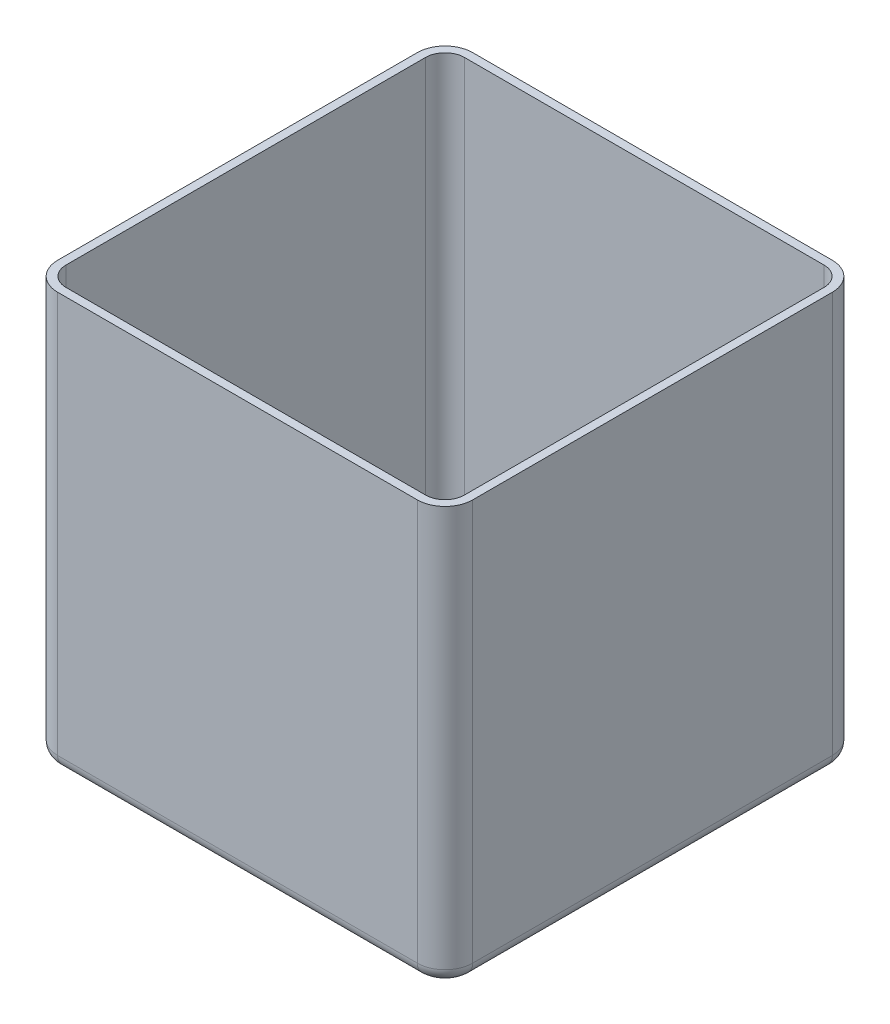
ISO-10303-21;
HEADER;
FILE_DESCRIPTION(('STEP AP214'),'2;1');
FILE_NAME('part.step','',(''),(''),'','','');
FILE_SCHEMA(('AUTOMOTIVE_DESIGN { 1 0 10303 214 1 1 1 1 }'));
ENDSEC;
DATA;
#1=APPLICATION_CONTEXT('core data for automotive mechanical design processes');
#2=APPLICATION_PROTOCOL_DEFINITION('international standard','automotive_design',2000,#1);
#3=PRODUCT_CONTEXT('',#1,'mechanical');
#4=PRODUCT('Part','Part','',(#3));
#5=PRODUCT_RELATED_PRODUCT_CATEGORY('part','',(#4));
#6=PRODUCT_DEFINITION_FORMATION('','',#4);
#7=PRODUCT_DEFINITION_CONTEXT('part definition',#1,'design');
#8=PRODUCT_DEFINITION('design','',#6,#7);
#9=PRODUCT_DEFINITION_SHAPE('','',#8);
#10=(LENGTH_UNIT() NAMED_UNIT(*) SI_UNIT(.MILLI.,.METRE.));
#11=(NAMED_UNIT(*) PLANE_ANGLE_UNIT() SI_UNIT($,.RADIAN.));
#12=(NAMED_UNIT(*) SI_UNIT($,.STERADIAN.) SOLID_ANGLE_UNIT());
#13=UNCERTAINTY_MEASURE_WITH_UNIT(LENGTH_MEASURE(1.E-05),#10,'distance_accuracy_value','');
#14=(GEOMETRIC_REPRESENTATION_CONTEXT(3) GLOBAL_UNCERTAINTY_ASSIGNED_CONTEXT((#13)) GLOBAL_UNIT_ASSIGNED_CONTEXT((#10,
#11,#12)) REPRESENTATION_CONTEXT('',''));
#15=CARTESIAN_POINT('',(0.,0.,0.));
#16=DIRECTION('',(0.,0.,1.));
#17=DIRECTION('',(1.,0.,0.));
#18=AXIS2_PLACEMENT_3D('',#15,#16,#17);
#19=CARTESIAN_POINT('',(-75.,-150.,75.));
#20=DIRECTION('',(-1.,0.,0.));
#21=DIRECTION('',(0.,0.,1.));
#22=AXIS2_PLACEMENT_3D('',#19,#20,#21);
#23=PLANE('',#22);
#24=DIRECTION('',(0.,1.,0.));
#25=VECTOR('',#24,1.);
#26=CARTESIAN_POINT('',(-75.,-150.,-65.));
#27=LINE('',#26,#25);
#28=CARTESIAN_POINT('',(-75.,0.,-65.));
#29=VERTEX_POINT('',#28);
#30=CARTESIAN_POINT('',(-75.,-145.,-65.));
#31=VERTEX_POINT('',#30);
#32=EDGE_CURVE('E325',#29,#31,#27,.F.);
#33=ORIENTED_EDGE('',*,*,#32,.T.);
#34=DIRECTION('',(0.,0.,1.));
#35=VECTOR('',#34,1.);
#36=CARTESIAN_POINT('',(-75.,-145.,65.));
#37=LINE('',#36,#35);
#38=CARTESIAN_POINT('',(-75.,-145.,65.));
#39=VERTEX_POINT('',#38);
#40=EDGE_CURVE('E380',#31,#39,#37,.T.);
#41=ORIENTED_EDGE('',*,*,#40,.T.);
#42=DIRECTION('',(0.,1.,0.));
#43=VECTOR('',#42,1.);
#44=CARTESIAN_POINT('',(-75.,-150.,65.));
#45=LINE('',#44,#43);
#46=CARTESIAN_POINT('',(-75.,0.,65.));
#47=VERTEX_POINT('',#46);
#48=EDGE_CURVE('E328',#39,#47,#45,.T.);
#49=ORIENTED_EDGE('',*,*,#48,.T.);
#50=DIRECTION('',(0.,0.,1.));
#51=VECTOR('',#50,1.);
#52=CARTESIAN_POINT('',(-75.,0.,75.));
#53=LINE('',#52,#51);
#54=EDGE_CURVE('E313',#29,#47,#53,.T.);
#55=ORIENTED_EDGE('',*,*,#54,.F.);
#56=EDGE_LOOP('',(#33,#41,#49,#55));
#57=FACE_BOUND('',#56,.T.);
#58=ADVANCED_FACE('F37',(#57),#23,.T.);
#59=CARTESIAN_POINT('',(75.,-150.,-75.));
#60=DIRECTION('',(0.,0.,-1.));
#61=DIRECTION('',(-1.,0.,0.));
#62=AXIS2_PLACEMENT_3D('',#59,#60,#61);
#63=PLANE('',#62);
#64=DIRECTION('',(0.,1.,0.));
#65=VECTOR('',#64,1.);
#66=CARTESIAN_POINT('',(65.,-150.,-75.));
#67=LINE('',#66,#65);
#68=CARTESIAN_POINT('',(65.,0.,-75.));
#69=VERTEX_POINT('',#68);
#70=CARTESIAN_POINT('',(65.,-145.,-75.));
#71=VERTEX_POINT('',#70);
#72=EDGE_CURVE('E342',#69,#71,#67,.F.);
#73=ORIENTED_EDGE('',*,*,#72,.T.);
#74=DIRECTION('',(-1.,0.,0.));
#75=VECTOR('',#74,1.);
#76=CARTESIAN_POINT('',(-65.,-145.,-75.));
#77=LINE('',#76,#75);
#78=CARTESIAN_POINT('',(-65.,-145.,-75.));
#79=VERTEX_POINT('',#78);
#80=EDGE_CURVE('E376',#71,#79,#77,.T.);
#81=ORIENTED_EDGE('',*,*,#80,.T.);
#82=DIRECTION('',(0.,1.,0.));
#83=VECTOR('',#82,1.);
#84=CARTESIAN_POINT('',(-65.,-150.,-75.));
#85=LINE('',#84,#83);
#86=CARTESIAN_POINT('',(-65.,0.,-75.));
#87=VERTEX_POINT('',#86);
#88=EDGE_CURVE('E345',#79,#87,#85,.T.);
#89=ORIENTED_EDGE('',*,*,#88,.T.);
#90=DIRECTION('',(-1.,0.,0.));
#91=VECTOR('',#90,1.);
#92=CARTESIAN_POINT('',(75.,0.,-75.));
#93=LINE('',#92,#91);
#94=EDGE_CURVE('E322',#69,#87,#93,.T.);
#95=ORIENTED_EDGE('',*,*,#94,.F.);
#96=EDGE_LOOP('',(#73,#81,#89,#95));
#97=FACE_BOUND('',#96,.T.);
#98=ADVANCED_FACE('F428',(#97),#63,.T.);
#99=CARTESIAN_POINT('',(75.,-150.,75.));
#100=DIRECTION('',(1.,0.,0.));
#101=DIRECTION('',(0.,0.,-1.));
#102=AXIS2_PLACEMENT_3D('',#99,#100,#101);
#103=PLANE('',#102);
#104=DIRECTION('',(0.,1.,0.));
#105=VECTOR('',#104,1.);
#106=CARTESIAN_POINT('',(75.,-150.,65.));
#107=LINE('',#106,#105);
#108=CARTESIAN_POINT('',(75.,0.,65.));
#109=VERTEX_POINT('',#108);
#110=CARTESIAN_POINT('',(75.,-145.,65.));
#111=VERTEX_POINT('',#110);
#112=EDGE_CURVE('E349',#109,#111,#107,.F.);
#113=ORIENTED_EDGE('',*,*,#112,.T.);
#114=DIRECTION('',(0.,0.,-1.));
#115=VECTOR('',#114,1.);
#116=CARTESIAN_POINT('',(75.,-145.,-65.));
#117=LINE('',#116,#115);
#118=CARTESIAN_POINT('',(75.,-145.,-65.));
#119=VERTEX_POINT('',#118);
#120=EDGE_CURVE('E372',#111,#119,#117,.T.);
#121=ORIENTED_EDGE('',*,*,#120,.T.);
#122=DIRECTION('',(0.,1.,0.));
#123=VECTOR('',#122,1.);
#124=CARTESIAN_POINT('',(75.,-150.,-65.));
#125=LINE('',#124,#123);
#126=CARTESIAN_POINT('',(75.,0.,-65.));
#127=VERTEX_POINT('',#126);
#128=EDGE_CURVE('E347',#119,#127,#125,.T.);
#129=ORIENTED_EDGE('',*,*,#128,.T.);
#130=DIRECTION('',(0.,0.,-1.));
#131=VECTOR('',#130,1.);
#132=CARTESIAN_POINT('',(75.,0.,75.));
#133=LINE('',#132,#131);
#134=EDGE_CURVE('E319',#109,#127,#133,.T.);
#135=ORIENTED_EDGE('',*,*,#134,.F.);
#136=EDGE_LOOP('',(#113,#121,#129,#135));
#137=FACE_BOUND('',#136,.T.);
#138=ADVANCED_FACE('F481',(#137),#103,.T.);
#139=CARTESIAN_POINT('',(75.,-150.,75.));
#140=DIRECTION('',(0.,0.,1.));
#141=DIRECTION('',(1.,0.,0.));
#142=AXIS2_PLACEMENT_3D('',#139,#140,#141);
#143=PLANE('',#142);
#144=DIRECTION('',(0.,1.,0.));
#145=VECTOR('',#144,1.);
#146=CARTESIAN_POINT('',(-65.,-150.,75.));
#147=LINE('',#146,#145);
#148=CARTESIAN_POINT('',(-65.,0.,75.));
#149=VERTEX_POINT('',#148);
#150=CARTESIAN_POINT('',(-65.,-145.,75.));
#151=VERTEX_POINT('',#150);
#152=EDGE_CURVE('E340',#149,#151,#147,.F.);
#153=ORIENTED_EDGE('',*,*,#152,.T.);
#154=DIRECTION('',(1.,0.,0.));
#155=VECTOR('',#154,1.);
#156=CARTESIAN_POINT('',(65.,-145.,75.));
#157=LINE('',#156,#155);
#158=CARTESIAN_POINT('',(65.,-145.,75.));
#159=VERTEX_POINT('',#158);
#160=EDGE_CURVE('E11',#151,#159,#157,.T.);
#161=ORIENTED_EDGE('',*,*,#160,.T.);
#162=DIRECTION('',(0.,1.,0.));
#163=VECTOR('',#162,1.);
#164=CARTESIAN_POINT('',(65.,-150.,75.));
#165=LINE('',#164,#163);
#166=CARTESIAN_POINT('',(65.,0.,75.));
#167=VERTEX_POINT('',#166);
#168=EDGE_CURVE('E338',#159,#167,#165,.T.);
#169=ORIENTED_EDGE('',*,*,#168,.T.);
#170=DIRECTION('',(1.,0.,0.));
#171=VECTOR('',#170,1.);
#172=CARTESIAN_POINT('',(75.,0.,75.));
#173=LINE('',#172,#171);
#174=EDGE_CURVE('E316',#149,#167,#173,.T.);
#175=ORIENTED_EDGE('',*,*,#174,.F.);
#176=EDGE_LOOP('',(#153,#161,#169,#175));
#177=FACE_BOUND('',#176,.T.);
#178=ADVANCED_FACE('F458',(#177),#143,.T.);
#179=CARTESIAN_POINT('',(-75.,-150.,-75.));
#180=DIRECTION('',(0.,1.,0.));
#181=DIRECTION('',(0.,0.,1.));
#182=AXIS2_PLACEMENT_3D('',#179,#180,#181);
#183=PLANE('',#182);
#184=DIRECTION('',(0.,0.,-1.));
#185=VECTOR('',#184,1.);
#186=CARTESIAN_POINT('',(70.,-150.,65.));
#187=LINE('',#186,#185);
#188=CARTESIAN_POINT('',(70.,-150.,-65.));
#189=VERTEX_POINT('',#188);
#190=CARTESIAN_POINT('',(70.,-150.,65.));
#191=VERTEX_POINT('',#190);
#192=EDGE_CURVE('E364',#189,#191,#187,.F.);
#193=ORIENTED_EDGE('',*,*,#192,.T.);
#194=CARTESIAN_POINT('',(65.,-150.,65.));
#195=DIRECTION('',(0.,1.,0.));
#196=DIRECTION('',(0.,0.,1.));
#197=AXIS2_PLACEMENT_3D('',#194,#195,#196);
#198=CIRCLE('',#197,5.);
#199=CARTESIAN_POINT('',(65.,-150.,70.));
#200=VERTEX_POINT('',#199);
#201=EDGE_CURVE('E366',#191,#200,#198,.F.);
#202=ORIENTED_EDGE('',*,*,#201,.T.);
#203=DIRECTION('',(1.,0.,0.));
#204=VECTOR('',#203,1.);
#205=CARTESIAN_POINT('',(-65.,-150.,70.));
#206=LINE('',#205,#204);
#207=CARTESIAN_POINT('',(-65.,-150.,70.));
#208=VERTEX_POINT('',#207);
#209=EDGE_CURVE('E352',#200,#208,#206,.F.);
#210=ORIENTED_EDGE('',*,*,#209,.T.);
#211=CARTESIAN_POINT('',(-65.,-150.,65.));
#212=DIRECTION('',(0.,1.,0.));
#213=DIRECTION('',(0.,0.,1.));
#214=AXIS2_PLACEMENT_3D('',#211,#212,#213);
#215=CIRCLE('',#214,5.);
#216=CARTESIAN_POINT('',(-70.,-150.,65.));
#217=VERTEX_POINT('',#216);
#218=EDGE_CURVE('E354',#208,#217,#215,.F.);
#219=ORIENTED_EDGE('',*,*,#218,.T.);
#220=DIRECTION('',(0.,0.,1.));
#221=VECTOR('',#220,1.);
#222=CARTESIAN_POINT('',(-70.,-150.,-65.));
#223=LINE('',#222,#221);
#224=CARTESIAN_POINT('',(-70.,-150.,-65.));
#225=VERTEX_POINT('',#224);
#226=EDGE_CURVE('E356',#217,#225,#223,.F.);
#227=ORIENTED_EDGE('',*,*,#226,.T.);
#228=CARTESIAN_POINT('',(-65.,-150.,-65.));
#229=DIRECTION('',(0.,1.,0.));
#230=DIRECTION('',(0.,0.,1.));
#231=AXIS2_PLACEMENT_3D('',#228,#229,#230);
#232=CIRCLE('',#231,5.);
#233=CARTESIAN_POINT('',(-65.,-150.,-70.));
#234=VERTEX_POINT('',#233);
#235=EDGE_CURVE('E358',#225,#234,#232,.F.);
#236=ORIENTED_EDGE('',*,*,#235,.T.);
#237=DIRECTION('',(-1.,0.,0.));
#238=VECTOR('',#237,1.);
#239=CARTESIAN_POINT('',(65.,-150.,-70.));
#240=LINE('',#239,#238);
#241=CARTESIAN_POINT('',(65.,-150.,-70.));
#242=VERTEX_POINT('',#241);
#243=EDGE_CURVE('E360',#234,#242,#240,.F.);
#244=ORIENTED_EDGE('',*,*,#243,.T.);
#245=CARTESIAN_POINT('',(65.,-150.,-65.));
#246=DIRECTION('',(0.,1.,0.));
#247=DIRECTION('',(0.,0.,1.));
#248=AXIS2_PLACEMENT_3D('',#245,#246,#247);
#249=CIRCLE('',#248,5.);
#250=EDGE_CURVE('E362',#242,#189,#249,.F.);
#251=ORIENTED_EDGE('',*,*,#250,.T.);
#252=EDGE_LOOP('',(#193,#202,#210,#219,#227,#236,#244,#251));
#253=FACE_BOUND('',#252,.T.);
#254=ADVANCED_FACE('F444',(#253),#183,.F.);
#255=CARTESIAN_POINT('',(-75.,0.,-75.));
#256=DIRECTION('',(0.,1.,0.));
#257=DIRECTION('',(0.,0.,1.));
#258=AXIS2_PLACEMENT_3D('',#255,#256,#257);
#259=PLANE('',#258);
#260=DIRECTION('',(0.,0.,1.));
#261=VECTOR('',#260,1.);
#262=CARTESIAN_POINT('',(-72.,0.,-75.));
#263=LINE('',#262,#261);
#264=CARTESIAN_POINT('',(-72.,0.,-65.));
#265=VERTEX_POINT('',#264);
#266=CARTESIAN_POINT('',(-72.,0.,65.));
#267=VERTEX_POINT('',#266);
#268=EDGE_CURVE('E219',#265,#267,#263,.T.);
#269=ORIENTED_EDGE('',*,*,#268,.F.);
#270=CARTESIAN_POINT('',(-65.,0.,-65.));
#271=DIRECTION('',(0.,1.,0.));
#272=DIRECTION('',(0.,0.,1.));
#273=AXIS2_PLACEMENT_3D('',#270,#271,#272);
#274=CIRCLE('',#273,7.);
#275=CARTESIAN_POINT('',(-65.,0.,-72.));
#276=VERTEX_POINT('',#275);
#277=EDGE_CURVE('E302',#276,#265,#274,.T.);
#278=ORIENTED_EDGE('',*,*,#277,.F.);
#279=DIRECTION('',(-1.,0.,0.));
#280=VECTOR('',#279,1.);
#281=CARTESIAN_POINT('',(-75.,0.,-72.));
#282=LINE('',#281,#280);
#283=CARTESIAN_POINT('',(65.,0.,-72.));
#284=VERTEX_POINT('',#283);
#285=EDGE_CURVE('E54',#284,#276,#282,.T.);
#286=ORIENTED_EDGE('',*,*,#285,.F.);
#287=CARTESIAN_POINT('',(65.,0.,-65.));
#288=DIRECTION('',(0.,1.,0.));
#289=DIRECTION('',(0.,0.,1.));
#290=AXIS2_PLACEMENT_3D('',#287,#288,#289);
#291=CIRCLE('',#290,7.);
#292=CARTESIAN_POINT('',(72.,0.,-65.));
#293=VERTEX_POINT('',#292);
#294=EDGE_CURVE('E223',#293,#284,#291,.T.);
#295=ORIENTED_EDGE('',*,*,#294,.F.);
#296=DIRECTION('',(0.,0.,-1.));
#297=VECTOR('',#296,1.);
#298=CARTESIAN_POINT('',(72.,0.,-75.));
#299=LINE('',#298,#297);
#300=CARTESIAN_POINT('',(72.,0.,65.));
#301=VERTEX_POINT('',#300);
#302=EDGE_CURVE('E305',#301,#293,#299,.T.);
#303=ORIENTED_EDGE('',*,*,#302,.F.);
#304=CARTESIAN_POINT('',(65.,0.,65.));
#305=DIRECTION('',(0.,1.,0.));
#306=DIRECTION('',(0.,0.,1.));
#307=AXIS2_PLACEMENT_3D('',#304,#305,#306);
#308=CIRCLE('',#307,7.);
#309=CARTESIAN_POINT('',(65.,0.,72.));
#310=VERTEX_POINT('',#309);
#311=EDGE_CURVE('E306',#310,#301,#308,.T.);
#312=ORIENTED_EDGE('',*,*,#311,.F.);
#313=DIRECTION('',(1.,0.,0.));
#314=VECTOR('',#313,1.);
#315=CARTESIAN_POINT('',(-75.,0.,72.));
#316=LINE('',#315,#314);
#317=CARTESIAN_POINT('',(-65.,0.,72.));
#318=VERTEX_POINT('',#317);
#319=EDGE_CURVE('E300',#318,#310,#316,.T.);
#320=ORIENTED_EDGE('',*,*,#319,.F.);
#321=CARTESIAN_POINT('',(-65.,0.,65.));
#322=DIRECTION('',(0.,1.,0.));
#323=DIRECTION('',(0.,0.,1.));
#324=AXIS2_PLACEMENT_3D('',#321,#322,#323);
#325=CIRCLE('',#324,7.);
#326=EDGE_CURVE('E249',#267,#318,#325,.T.);
#327=ORIENTED_EDGE('',*,*,#326,.F.);
#328=EDGE_LOOP('',(#269,#278,#286,#295,#303,#312,#320,#327));
#329=FACE_BOUND('',#328,.T.);
#330=ORIENTED_EDGE('',*,*,#54,.T.);
#331=CARTESIAN_POINT('',(-65.,0.,65.));
#332=DIRECTION('',(0.,1.,0.));
#333=DIRECTION('',(0.,0.,1.));
#334=AXIS2_PLACEMENT_3D('',#331,#332,#333);
#335=CIRCLE('',#334,10.);
#336=EDGE_CURVE('E336',#47,#149,#335,.T.);
#337=ORIENTED_EDGE('',*,*,#336,.T.);
#338=ORIENTED_EDGE('',*,*,#174,.T.);
#339=CARTESIAN_POINT('',(65.,0.,65.));
#340=DIRECTION('',(0.,1.,0.));
#341=DIRECTION('',(0.,0.,1.));
#342=AXIS2_PLACEMENT_3D('',#339,#340,#341);
#343=CIRCLE('',#342,10.);
#344=EDGE_CURVE('E332',#167,#109,#343,.T.);
#345=ORIENTED_EDGE('',*,*,#344,.T.);
#346=ORIENTED_EDGE('',*,*,#134,.T.);
#347=CARTESIAN_POINT('',(65.,0.,-65.));
#348=DIRECTION('',(0.,1.,0.));
#349=DIRECTION('',(0.,0.,1.));
#350=AXIS2_PLACEMENT_3D('',#347,#348,#349);
#351=CIRCLE('',#350,10.);
#352=EDGE_CURVE('E330',#127,#69,#351,.T.);
#353=ORIENTED_EDGE('',*,*,#352,.T.);
#354=ORIENTED_EDGE('',*,*,#94,.T.);
#355=CARTESIAN_POINT('',(-65.,0.,-65.));
#356=DIRECTION('',(0.,1.,0.));
#357=DIRECTION('',(0.,0.,1.));
#358=AXIS2_PLACEMENT_3D('',#355,#356,#357);
#359=CIRCLE('',#358,10.);
#360=EDGE_CURVE('E334',#87,#29,#359,.T.);
#361=ORIENTED_EDGE('',*,*,#360,.T.);
#362=EDGE_LOOP('',(#330,#337,#338,#345,#346,#353,#354,#361));
#363=FACE_BOUND('',#362,.T.);
#364=ADVANCED_FACE('F422',(#329,#363),#259,.T.);
#365=CARTESIAN_POINT('',(-65.,-150.,65.));
#366=DIRECTION('',(0.,1.,0.));
#367=DIRECTION('',(0.,0.,1.));
#368=AXIS2_PLACEMENT_3D('',#365,#366,#367);
#369=CYLINDRICAL_SURFACE('',#368,10.);
#370=ORIENTED_EDGE('',*,*,#48,.F.);
#371=CARTESIAN_POINT('',(-65.,-145.,65.));
#372=DIRECTION('',(0.,1.,0.));
#373=DIRECTION('',(0.,0.,1.));
#374=AXIS2_PLACEMENT_3D('',#371,#372,#373);
#375=CIRCLE('',#374,10.);
#376=EDGE_CURVE('E46',#39,#151,#375,.T.);
#377=ORIENTED_EDGE('',*,*,#376,.T.);
#378=ORIENTED_EDGE('',*,*,#152,.F.);
#379=ORIENTED_EDGE('',*,*,#336,.F.);
#380=EDGE_LOOP('',(#370,#377,#378,#379));
#381=FACE_BOUND('',#380,.T.);
#382=ADVANCED_FACE('F486',(#381),#369,.T.);
#383=CARTESIAN_POINT('',(-65.,-150.,-65.));
#384=DIRECTION('',(0.,1.,0.));
#385=DIRECTION('',(0.,0.,1.));
#386=AXIS2_PLACEMENT_3D('',#383,#384,#385);
#387=CYLINDRICAL_SURFACE('',#386,10.);
#388=ORIENTED_EDGE('',*,*,#88,.F.);
#389=CARTESIAN_POINT('',(-65.,-145.,-65.));
#390=DIRECTION('',(0.,1.,0.));
#391=DIRECTION('',(0.,0.,1.));
#392=AXIS2_PLACEMENT_3D('',#389,#390,#391);
#393=CIRCLE('',#392,10.);
#394=EDGE_CURVE('E378',#79,#31,#393,.T.);
#395=ORIENTED_EDGE('',*,*,#394,.T.);
#396=ORIENTED_EDGE('',*,*,#32,.F.);
#397=ORIENTED_EDGE('',*,*,#360,.F.);
#398=EDGE_LOOP('',(#388,#395,#396,#397));
#399=FACE_BOUND('',#398,.T.);
#400=ADVANCED_FACE('F416',(#399),#387,.T.);
#401=CARTESIAN_POINT('',(65.,-150.,65.));
#402=DIRECTION('',(0.,1.,0.));
#403=DIRECTION('',(0.,0.,1.));
#404=AXIS2_PLACEMENT_3D('',#401,#402,#403);
#405=CYLINDRICAL_SURFACE('',#404,10.);
#406=ORIENTED_EDGE('',*,*,#168,.F.);
#407=CARTESIAN_POINT('',(65.,-145.,65.));
#408=DIRECTION('',(0.,1.,0.));
#409=DIRECTION('',(0.,0.,1.));
#410=AXIS2_PLACEMENT_3D('',#407,#408,#409);
#411=CIRCLE('',#410,10.);
#412=EDGE_CURVE('E369',#159,#111,#411,.T.);
#413=ORIENTED_EDGE('',*,*,#412,.T.);
#414=ORIENTED_EDGE('',*,*,#112,.F.);
#415=ORIENTED_EDGE('',*,*,#344,.F.);
#416=EDGE_LOOP('',(#406,#413,#414,#415));
#417=FACE_BOUND('',#416,.T.);
#418=ADVANCED_FACE('F462',(#417),#405,.T.);
#419=CARTESIAN_POINT('',(65.,-150.,-65.));
#420=DIRECTION('',(0.,1.,0.));
#421=DIRECTION('',(0.,0.,1.));
#422=AXIS2_PLACEMENT_3D('',#419,#420,#421);
#423=CYLINDRICAL_SURFACE('',#422,10.);
#424=ORIENTED_EDGE('',*,*,#128,.F.);
#425=CARTESIAN_POINT('',(65.,-145.,-65.));
#426=DIRECTION('',(0.,1.,0.));
#427=DIRECTION('',(0.,0.,1.));
#428=AXIS2_PLACEMENT_3D('',#425,#426,#427);
#429=CIRCLE('',#428,10.);
#430=EDGE_CURVE('E374',#119,#71,#429,.T.);
#431=ORIENTED_EDGE('',*,*,#430,.T.);
#432=ORIENTED_EDGE('',*,*,#72,.F.);
#433=ORIENTED_EDGE('',*,*,#352,.F.);
#434=EDGE_LOOP('',(#424,#431,#432,#433));
#435=FACE_BOUND('',#434,.T.);
#436=ADVANCED_FACE('F431',(#435),#423,.T.);
#437=CARTESIAN_POINT('',(-65.,-145.,-65.));
#438=DIRECTION('',(0.,1.,0.));
#439=DIRECTION('',(0.,0.,1.));
#440=AXIS2_PLACEMENT_3D('',#437,#438,#439);
#441=DEGENERATE_TOROIDAL_SURFACE('',#440,5.,5.,.T.);
#442=CARTESIAN_POINT('',(-70.,-145.,-65.));
#443=DIRECTION('',(0.,0.,1.));
#444=DIRECTION('',(1.,0.,0.));
#445=AXIS2_PLACEMENT_3D('',#442,#443,#444);
#446=CIRCLE('',#445,5.);
#447=EDGE_CURVE('E397',#31,#225,#446,.T.);
#448=ORIENTED_EDGE('',*,*,#447,.F.);
#449=ORIENTED_EDGE('',*,*,#394,.F.);
#450=CARTESIAN_POINT('',(-65.,-145.,-70.));
#451=DIRECTION('',(1.,0.,0.));
#452=DIRECTION('',(0.,0.,-1.));
#453=AXIS2_PLACEMENT_3D('',#450,#451,#452);
#454=CIRCLE('',#453,5.);
#455=EDGE_CURVE('E41',#234,#79,#454,.T.);
#456=ORIENTED_EDGE('',*,*,#455,.F.);
#457=ORIENTED_EDGE('',*,*,#235,.F.);
#458=EDGE_LOOP('',(#448,#449,#456,#457));
#459=FACE_BOUND('',#458,.T.);
#460=ADVANCED_FACE('F39',(#459),#441,.T.);
#461=CARTESIAN_POINT('',(75.,-145.,-70.));
#462=DIRECTION('',(1.,0.,0.));
#463=DIRECTION('',(0.,0.,-1.));
#464=AXIS2_PLACEMENT_3D('',#461,#462,#463);
#465=CYLINDRICAL_SURFACE('',#464,5.);
#466=ORIENTED_EDGE('',*,*,#455,.T.);
#467=ORIENTED_EDGE('',*,*,#80,.F.);
#468=CARTESIAN_POINT('',(65.,-145.,-70.));
#469=DIRECTION('',(1.,0.,0.));
#470=DIRECTION('',(0.,0.,-1.));
#471=AXIS2_PLACEMENT_3D('',#468,#469,#470);
#472=CIRCLE('',#471,5.);
#473=EDGE_CURVE('E395',#242,#71,#472,.T.);
#474=ORIENTED_EDGE('',*,*,#473,.F.);
#475=ORIENTED_EDGE('',*,*,#243,.F.);
#476=EDGE_LOOP('',(#466,#467,#474,#475));
#477=FACE_BOUND('',#476,.T.);
#478=ADVANCED_FACE('F408',(#477),#465,.T.);
#479=CARTESIAN_POINT('',(-70.,-145.,75.));
#480=DIRECTION('',(0.,0.,-1.));
#481=DIRECTION('',(-1.,0.,0.));
#482=AXIS2_PLACEMENT_3D('',#479,#480,#481);
#483=CYLINDRICAL_SURFACE('',#482,5.);
#484=ORIENTED_EDGE('',*,*,#447,.T.);
#485=ORIENTED_EDGE('',*,*,#226,.F.);
#486=CARTESIAN_POINT('',(-70.,-145.,65.));
#487=DIRECTION('',(0.,0.,1.));
#488=DIRECTION('',(1.,0.,0.));
#489=AXIS2_PLACEMENT_3D('',#486,#487,#488);
#490=CIRCLE('',#489,5.);
#491=EDGE_CURVE('E392',#39,#217,#490,.T.);
#492=ORIENTED_EDGE('',*,*,#491,.F.);
#493=ORIENTED_EDGE('',*,*,#40,.F.);
#494=EDGE_LOOP('',(#484,#485,#492,#493));
#495=FACE_BOUND('',#494,.T.);
#496=ADVANCED_FACE('F447',(#495),#483,.T.);
#497=CARTESIAN_POINT('',(65.,-145.,-65.));
#498=DIRECTION('',(0.,1.,0.));
#499=DIRECTION('',(0.,0.,1.));
#500=AXIS2_PLACEMENT_3D('',#497,#498,#499);
#501=DEGENERATE_TOROIDAL_SURFACE('',#500,5.,5.,.T.);
#502=ORIENTED_EDGE('',*,*,#473,.T.);
#503=ORIENTED_EDGE('',*,*,#430,.F.);
#504=CARTESIAN_POINT('',(70.,-145.,-65.));
#505=DIRECTION('',(0.,0.,1.));
#506=DIRECTION('',(1.,0.,0.));
#507=AXIS2_PLACEMENT_3D('',#504,#505,#506);
#508=CIRCLE('',#507,5.);
#509=EDGE_CURVE('E389',#189,#119,#508,.T.);
#510=ORIENTED_EDGE('',*,*,#509,.F.);
#511=ORIENTED_EDGE('',*,*,#250,.F.);
#512=EDGE_LOOP('',(#502,#503,#510,#511));
#513=FACE_BOUND('',#512,.T.);
#514=ADVANCED_FACE('F435',(#513),#501,.T.);
#515=CARTESIAN_POINT('',(-65.,-145.,65.));
#516=DIRECTION('',(0.,1.,0.));
#517=DIRECTION('',(0.,0.,1.));
#518=AXIS2_PLACEMENT_3D('',#515,#516,#517);
#519=DEGENERATE_TOROIDAL_SURFACE('',#518,5.,5.,.T.);
#520=ORIENTED_EDGE('',*,*,#491,.T.);
#521=ORIENTED_EDGE('',*,*,#218,.F.);
#522=CARTESIAN_POINT('',(-65.,-145.,70.));
#523=DIRECTION('',(1.,0.,0.));
#524=DIRECTION('',(0.,0.,-1.));
#525=AXIS2_PLACEMENT_3D('',#522,#523,#524);
#526=CIRCLE('',#525,5.);
#527=EDGE_CURVE('E386',#151,#208,#526,.T.);
#528=ORIENTED_EDGE('',*,*,#527,.F.);
#529=ORIENTED_EDGE('',*,*,#376,.F.);
#530=EDGE_LOOP('',(#520,#521,#528,#529));
#531=FACE_BOUND('',#530,.T.);
#532=ADVANCED_FACE('F449',(#531),#519,.T.);
#533=CARTESIAN_POINT('',(70.,-145.,75.));
#534=DIRECTION('',(0.,0.,1.));
#535=DIRECTION('',(1.,0.,0.));
#536=AXIS2_PLACEMENT_3D('',#533,#534,#535);
#537=CYLINDRICAL_SURFACE('',#536,5.);
#538=ORIENTED_EDGE('',*,*,#509,.T.);
#539=ORIENTED_EDGE('',*,*,#120,.F.);
#540=CARTESIAN_POINT('',(70.,-145.,65.));
#541=DIRECTION('',(0.,0.,1.));
#542=DIRECTION('',(1.,0.,0.));
#543=AXIS2_PLACEMENT_3D('',#540,#541,#542);
#544=CIRCLE('',#543,5.);
#545=EDGE_CURVE('E384',#191,#111,#544,.T.);
#546=ORIENTED_EDGE('',*,*,#545,.F.);
#547=ORIENTED_EDGE('',*,*,#192,.F.);
#548=EDGE_LOOP('',(#538,#539,#546,#547));
#549=FACE_BOUND('',#548,.T.);
#550=ADVANCED_FACE('F440',(#549),#537,.T.);
#551=CARTESIAN_POINT('',(75.,-145.,70.));
#552=DIRECTION('',(-1.,0.,0.));
#553=DIRECTION('',(0.,0.,1.));
#554=AXIS2_PLACEMENT_3D('',#551,#552,#553);
#555=CYLINDRICAL_SURFACE('',#554,5.);
#556=ORIENTED_EDGE('',*,*,#527,.T.);
#557=ORIENTED_EDGE('',*,*,#209,.F.);
#558=CARTESIAN_POINT('',(65.,-145.,70.));
#559=DIRECTION('',(1.,0.,0.));
#560=DIRECTION('',(0.,0.,-1.));
#561=AXIS2_PLACEMENT_3D('',#558,#559,#560);
#562=CIRCLE('',#561,5.);
#563=EDGE_CURVE('E242',#159,#200,#562,.T.);
#564=ORIENTED_EDGE('',*,*,#563,.F.);
#565=ORIENTED_EDGE('',*,*,#160,.F.);
#566=EDGE_LOOP('',(#556,#557,#564,#565));
#567=FACE_BOUND('',#566,.T.);
#568=ADVANCED_FACE('F455',(#567),#555,.T.);
#569=CARTESIAN_POINT('',(65.,-145.,65.));
#570=DIRECTION('',(0.,1.,0.));
#571=DIRECTION('',(0.,0.,1.));
#572=AXIS2_PLACEMENT_3D('',#569,#570,#571);
#573=DEGENERATE_TOROIDAL_SURFACE('',#572,5.,5.,.T.);
#574=ORIENTED_EDGE('',*,*,#545,.T.);
#575=ORIENTED_EDGE('',*,*,#412,.F.);
#576=ORIENTED_EDGE('',*,*,#563,.T.);
#577=ORIENTED_EDGE('',*,*,#201,.F.);
#578=EDGE_LOOP('',(#574,#575,#576,#577));
#579=FACE_BOUND('',#578,.T.);
#580=ADVANCED_FACE('F465',(#579),#573,.T.);
#581=CARTESIAN_POINT('',(-72.,-150.,75.));
#582=DIRECTION('',(-1.,0.,0.));
#583=DIRECTION('',(0.,0.,1.));
#584=AXIS2_PLACEMENT_3D('',#581,#582,#583);
#585=PLANE('',#584);
#586=DIRECTION('',(0.,1.,0.));
#587=VECTOR('',#586,1.);
#588=CARTESIAN_POINT('',(-72.,-150.,-65.));
#589=LINE('',#588,#587);
#590=CARTESIAN_POINT('',(-72.,-145.,-65.));
#591=VERTEX_POINT('',#590);
#592=EDGE_CURVE('E224',#265,#591,#589,.F.);
#593=ORIENTED_EDGE('',*,*,#592,.F.);
#594=ORIENTED_EDGE('',*,*,#268,.T.);
#595=DIRECTION('',(0.,1.,0.));
#596=VECTOR('',#595,1.);
#597=CARTESIAN_POINT('',(-72.,-150.,65.));
#598=LINE('',#597,#596);
#599=CARTESIAN_POINT('',(-72.,-145.,65.));
#600=VERTEX_POINT('',#599);
#601=EDGE_CURVE('E216',#600,#267,#598,.T.);
#602=ORIENTED_EDGE('',*,*,#601,.F.);
#603=DIRECTION('',(0.,0.,1.));
#604=VECTOR('',#603,1.);
#605=CARTESIAN_POINT('',(-72.,-145.,75.));
#606=LINE('',#605,#604);
#607=EDGE_CURVE('E203',#591,#600,#606,.T.);
#608=ORIENTED_EDGE('',*,*,#607,.F.);
#609=EDGE_LOOP('',(#593,#594,#602,#608));
#610=FACE_BOUND('',#609,.T.);
#611=ADVANCED_FACE('F217',(#610),#585,.F.);
#612=CARTESIAN_POINT('',(75.,-150.,-72.));
#613=DIRECTION('',(0.,0.,-1.));
#614=DIRECTION('',(-1.,0.,0.));
#615=AXIS2_PLACEMENT_3D('',#612,#613,#614);
#616=PLANE('',#615);
#617=DIRECTION('',(0.,1.,0.));
#618=VECTOR('',#617,1.);
#619=CARTESIAN_POINT('',(65.,-150.,-72.));
#620=LINE('',#619,#618);
#621=CARTESIAN_POINT('',(65.,-145.,-72.));
#622=VERTEX_POINT('',#621);
#623=EDGE_CURVE('E245',#284,#622,#620,.F.);
#624=ORIENTED_EDGE('',*,*,#623,.F.);
#625=ORIENTED_EDGE('',*,*,#285,.T.);
#626=DIRECTION('',(0.,1.,0.));
#627=VECTOR('',#626,1.);
#628=CARTESIAN_POINT('',(-65.,-150.,-72.));
#629=LINE('',#628,#627);
#630=CARTESIAN_POINT('',(-65.,-145.,-72.));
#631=VERTEX_POINT('',#630);
#632=EDGE_CURVE('E263',#631,#276,#629,.T.);
#633=ORIENTED_EDGE('',*,*,#632,.F.);
#634=DIRECTION('',(-1.,0.,0.));
#635=VECTOR('',#634,1.);
#636=CARTESIAN_POINT('',(75.,-145.,-72.));
#637=LINE('',#636,#635);
#638=EDGE_CURVE('E265',#622,#631,#637,.T.);
#639=ORIENTED_EDGE('',*,*,#638,.F.);
#640=EDGE_LOOP('',(#624,#625,#633,#639));
#641=FACE_BOUND('',#640,.T.);
#642=ADVANCED_FACE('F472',(#641),#616,.F.);
#643=CARTESIAN_POINT('',(72.,-150.,75.));
#644=DIRECTION('',(1.,0.,0.));
#645=DIRECTION('',(0.,0.,-1.));
#646=AXIS2_PLACEMENT_3D('',#643,#644,#645);
#647=PLANE('',#646);
#648=DIRECTION('',(0.,1.,0.));
#649=VECTOR('',#648,1.);
#650=CARTESIAN_POINT('',(72.,-150.,65.));
#651=LINE('',#650,#649);
#652=CARTESIAN_POINT('',(72.,-145.,65.));
#653=VERTEX_POINT('',#652);
#654=EDGE_CURVE('E255',#301,#653,#651,.F.);
#655=ORIENTED_EDGE('',*,*,#654,.F.);
#656=ORIENTED_EDGE('',*,*,#302,.T.);
#657=DIRECTION('',(0.,1.,0.));
#658=VECTOR('',#657,1.);
#659=CARTESIAN_POINT('',(72.,-150.,-65.));
#660=LINE('',#659,#658);
#661=CARTESIAN_POINT('',(72.,-145.,-65.));
#662=VERTEX_POINT('',#661);
#663=EDGE_CURVE('E259',#662,#293,#660,.T.);
#664=ORIENTED_EDGE('',*,*,#663,.F.);
#665=DIRECTION('',(0.,0.,-1.));
#666=VECTOR('',#665,1.);
#667=CARTESIAN_POINT('',(72.,-145.,75.));
#668=LINE('',#667,#666);
#669=EDGE_CURVE('E253',#653,#662,#668,.T.);
#670=ORIENTED_EDGE('',*,*,#669,.F.);
#671=EDGE_LOOP('',(#655,#656,#664,#670));
#672=FACE_BOUND('',#671,.T.);
#673=ADVANCED_FACE('F549',(#672),#647,.F.);
#674=CARTESIAN_POINT('',(75.,-150.,72.));
#675=DIRECTION('',(0.,0.,1.));
#676=DIRECTION('',(1.,0.,0.));
#677=AXIS2_PLACEMENT_3D('',#674,#675,#676);
#678=PLANE('',#677);
#679=DIRECTION('',(0.,1.,0.));
#680=VECTOR('',#679,1.);
#681=CARTESIAN_POINT('',(-65.,-150.,72.));
#682=LINE('',#681,#680);
#683=CARTESIAN_POINT('',(-65.,-145.,72.));
#684=VERTEX_POINT('',#683);
#685=EDGE_CURVE('E238',#318,#684,#682,.F.);
#686=ORIENTED_EDGE('',*,*,#685,.F.);
#687=ORIENTED_EDGE('',*,*,#319,.T.);
#688=DIRECTION('',(0.,1.,0.));
#689=VECTOR('',#688,1.);
#690=CARTESIAN_POINT('',(65.,-150.,72.));
#691=LINE('',#690,#689);
#692=CARTESIAN_POINT('',(65.,-145.,72.));
#693=VERTEX_POINT('',#692);
#694=EDGE_CURVE('E246',#693,#310,#691,.T.);
#695=ORIENTED_EDGE('',*,*,#694,.F.);
#696=DIRECTION('',(1.,0.,0.));
#697=VECTOR('',#696,1.);
#698=CARTESIAN_POINT('',(75.,-145.,72.));
#699=LINE('',#698,#697);
#700=EDGE_CURVE('E240',#684,#693,#699,.T.);
#701=ORIENTED_EDGE('',*,*,#700,.F.);
#702=EDGE_LOOP('',(#686,#687,#695,#701));
#703=FACE_BOUND('',#702,.T.);
#704=ADVANCED_FACE('F558',(#703),#678,.F.);
#705=CARTESIAN_POINT('',(-75.,-147.,-75.));
#706=DIRECTION('',(0.,1.,0.));
#707=DIRECTION('',(0.,0.,1.));
#708=AXIS2_PLACEMENT_3D('',#705,#706,#707);
#709=PLANE('',#708);
#710=DIRECTION('',(0.,0.,1.));
#711=VECTOR('',#710,1.);
#712=CARTESIAN_POINT('',(70.,-147.,-75.));
#713=LINE('',#712,#711);
#714=CARTESIAN_POINT('',(70.,-147.,-65.));
#715=VERTEX_POINT('',#714);
#716=CARTESIAN_POINT('',(70.,-147.,65.));
#717=VERTEX_POINT('',#716);
#718=EDGE_CURVE('E279',#715,#717,#713,.T.);
#719=ORIENTED_EDGE('',*,*,#718,.F.);
#720=CARTESIAN_POINT('',(65.,-147.,-65.));
#721=DIRECTION('',(0.,1.,0.));
#722=DIRECTION('',(0.,0.,1.));
#723=AXIS2_PLACEMENT_3D('',#720,#721,#722);
#724=CIRCLE('',#723,5.);
#725=CARTESIAN_POINT('',(65.,-147.,-70.));
#726=VERTEX_POINT('',#725);
#727=EDGE_CURVE('E281',#726,#715,#724,.F.);
#728=ORIENTED_EDGE('',*,*,#727,.F.);
#729=DIRECTION('',(1.,0.,0.));
#730=VECTOR('',#729,1.);
#731=CARTESIAN_POINT('',(-75.,-147.,-70.));
#732=LINE('',#731,#730);
#733=CARTESIAN_POINT('',(-65.,-147.,-70.));
#734=VERTEX_POINT('',#733);
#735=EDGE_CURVE('E277',#734,#726,#732,.T.);
#736=ORIENTED_EDGE('',*,*,#735,.F.);
#737=CARTESIAN_POINT('',(-65.,-147.,-65.));
#738=DIRECTION('',(0.,1.,0.));
#739=DIRECTION('',(0.,0.,1.));
#740=AXIS2_PLACEMENT_3D('',#737,#738,#739);
#741=CIRCLE('',#740,5.);
#742=CARTESIAN_POINT('',(-70.,-147.,-65.));
#743=VERTEX_POINT('',#742);
#744=EDGE_CURVE('E275',#743,#734,#741,.F.);
#745=ORIENTED_EDGE('',*,*,#744,.F.);
#746=DIRECTION('',(0.,0.,1.));
#747=VECTOR('',#746,1.);
#748=CARTESIAN_POINT('',(-70.,-147.,-75.));
#749=LINE('',#748,#747);
#750=CARTESIAN_POINT('',(-70.,-147.,65.));
#751=VERTEX_POINT('',#750);
#752=EDGE_CURVE('E278',#751,#743,#749,.F.);
#753=ORIENTED_EDGE('',*,*,#752,.F.);
#754=CARTESIAN_POINT('',(-65.,-147.,65.));
#755=DIRECTION('',(0.,1.,0.));
#756=DIRECTION('',(0.,0.,1.));
#757=AXIS2_PLACEMENT_3D('',#754,#755,#756);
#758=CIRCLE('',#757,5.);
#759=CARTESIAN_POINT('',(-65.,-147.,70.));
#760=VERTEX_POINT('',#759);
#761=EDGE_CURVE('E231',#760,#751,#758,.F.);
#762=ORIENTED_EDGE('',*,*,#761,.F.);
#763=DIRECTION('',(1.,0.,0.));
#764=VECTOR('',#763,1.);
#765=CARTESIAN_POINT('',(-75.,-147.,70.));
#766=LINE('',#765,#764);
#767=CARTESIAN_POINT('',(65.,-147.,70.));
#768=VERTEX_POINT('',#767);
#769=EDGE_CURVE('E258',#768,#760,#766,.F.);
#770=ORIENTED_EDGE('',*,*,#769,.F.);
#771=CARTESIAN_POINT('',(65.,-147.,65.));
#772=DIRECTION('',(0.,1.,0.));
#773=DIRECTION('',(0.,0.,1.));
#774=AXIS2_PLACEMENT_3D('',#771,#772,#773);
#775=CIRCLE('',#774,5.);
#776=EDGE_CURVE('E254',#717,#768,#775,.F.);
#777=ORIENTED_EDGE('',*,*,#776,.F.);
#778=EDGE_LOOP('',(#719,#728,#736,#745,#753,#762,#770,#777));
#779=FACE_BOUND('',#778,.T.);
#780=ADVANCED_FACE('F568',(#779),#709,.T.);
#781=CARTESIAN_POINT('',(-65.,-150.,65.));
#782=DIRECTION('',(0.,1.,0.));
#783=DIRECTION('',(0.,0.,1.));
#784=AXIS2_PLACEMENT_3D('',#781,#782,#783);
#785=CYLINDRICAL_SURFACE('',#784,7.);
#786=ORIENTED_EDGE('',*,*,#601,.T.);
#787=ORIENTED_EDGE('',*,*,#326,.T.);
#788=ORIENTED_EDGE('',*,*,#685,.T.);
#789=CARTESIAN_POINT('',(-65.,-145.,65.));
#790=DIRECTION('',(0.,1.,0.));
#791=DIRECTION('',(0.,0.,1.));
#792=AXIS2_PLACEMENT_3D('',#789,#790,#791);
#793=CIRCLE('',#792,7.);
#794=EDGE_CURVE('E212',#600,#684,#793,.T.);
#795=ORIENTED_EDGE('',*,*,#794,.F.);
#796=EDGE_LOOP('',(#786,#787,#788,#795));
#797=FACE_BOUND('',#796,.T.);
#798=ADVANCED_FACE('F236',(#797),#785,.F.);
#799=CARTESIAN_POINT('',(-65.,-150.,-65.));
#800=DIRECTION('',(0.,1.,0.));
#801=DIRECTION('',(0.,0.,1.));
#802=AXIS2_PLACEMENT_3D('',#799,#800,#801);
#803=CYLINDRICAL_SURFACE('',#802,7.);
#804=ORIENTED_EDGE('',*,*,#632,.T.);
#805=ORIENTED_EDGE('',*,*,#277,.T.);
#806=ORIENTED_EDGE('',*,*,#592,.T.);
#807=CARTESIAN_POINT('',(-65.,-145.,-65.));
#808=DIRECTION('',(0.,1.,0.));
#809=DIRECTION('',(0.,0.,1.));
#810=AXIS2_PLACEMENT_3D('',#807,#808,#809);
#811=CIRCLE('',#810,7.);
#812=EDGE_CURVE('E213',#631,#591,#811,.T.);
#813=ORIENTED_EDGE('',*,*,#812,.F.);
#814=EDGE_LOOP('',(#804,#805,#806,#813));
#815=FACE_BOUND('',#814,.T.);
#816=ADVANCED_FACE('F587',(#815),#803,.F.);
#817=CARTESIAN_POINT('',(65.,-150.,65.));
#818=DIRECTION('',(0.,1.,0.));
#819=DIRECTION('',(0.,0.,1.));
#820=AXIS2_PLACEMENT_3D('',#817,#818,#819);
#821=CYLINDRICAL_SURFACE('',#820,7.);
#822=ORIENTED_EDGE('',*,*,#694,.T.);
#823=ORIENTED_EDGE('',*,*,#311,.T.);
#824=ORIENTED_EDGE('',*,*,#654,.T.);
#825=CARTESIAN_POINT('',(65.,-145.,65.));
#826=DIRECTION('',(0.,1.,0.));
#827=DIRECTION('',(0.,0.,1.));
#828=AXIS2_PLACEMENT_3D('',#825,#826,#827);
#829=CIRCLE('',#828,7.);
#830=EDGE_CURVE('E250',#693,#653,#829,.T.);
#831=ORIENTED_EDGE('',*,*,#830,.F.);
#832=EDGE_LOOP('',(#822,#823,#824,#831));
#833=FACE_BOUND('',#832,.T.);
#834=ADVANCED_FACE('F596',(#833),#821,.F.);
#835=CARTESIAN_POINT('',(65.,-150.,-65.));
#836=DIRECTION('',(0.,1.,0.));
#837=DIRECTION('',(0.,0.,1.));
#838=AXIS2_PLACEMENT_3D('',#835,#836,#837);
#839=CYLINDRICAL_SURFACE('',#838,7.);
#840=ORIENTED_EDGE('',*,*,#663,.T.);
#841=ORIENTED_EDGE('',*,*,#294,.T.);
#842=ORIENTED_EDGE('',*,*,#623,.T.);
#843=CARTESIAN_POINT('',(65.,-145.,-65.));
#844=DIRECTION('',(0.,1.,0.));
#845=DIRECTION('',(0.,0.,1.));
#846=AXIS2_PLACEMENT_3D('',#843,#844,#845);
#847=CIRCLE('',#846,7.);
#848=EDGE_CURVE('E261',#662,#622,#847,.T.);
#849=ORIENTED_EDGE('',*,*,#848,.F.);
#850=EDGE_LOOP('',(#840,#841,#842,#849));
#851=FACE_BOUND('',#850,.T.);
#852=ADVANCED_FACE('F606',(#851),#839,.F.);
#853=CARTESIAN_POINT('',(-65.,-145.,-65.));
#854=DIRECTION('',(0.,1.,0.));
#855=DIRECTION('',(0.,0.,1.));
#856=AXIS2_PLACEMENT_3D('',#853,#854,#855);
#857=TOROIDAL_SURFACE('',#856,5.,2.);
#858=CARTESIAN_POINT('',(-70.,-145.,-65.));
#859=DIRECTION('',(0.,0.,-1.));
#860=DIRECTION('',(-1.,0.,0.));
#861=AXIS2_PLACEMENT_3D('',#858,#859,#860);
#862=CIRCLE('',#861,2.);
#863=EDGE_CURVE('E209',#591,#743,#862,.F.);
#864=ORIENTED_EDGE('',*,*,#863,.T.);
#865=ORIENTED_EDGE('',*,*,#744,.T.);
#866=CARTESIAN_POINT('',(-65.,-145.,-70.));
#867=DIRECTION('',(1.,0.,0.));
#868=DIRECTION('',(0.,0.,-1.));
#869=AXIS2_PLACEMENT_3D('',#866,#867,#868);
#870=CIRCLE('',#869,2.);
#871=EDGE_CURVE('E272',#734,#631,#870,.T.);
#872=ORIENTED_EDGE('',*,*,#871,.T.);
#873=ORIENTED_EDGE('',*,*,#812,.T.);
#874=EDGE_LOOP('',(#864,#865,#872,#873));
#875=FACE_BOUND('',#874,.T.);
#876=ADVANCED_FACE('F616',(#875),#857,.F.);
#877=CARTESIAN_POINT('',(75.,-145.,-70.));
#878=DIRECTION('',(1.,0.,0.));
#879=DIRECTION('',(0.,0.,-1.));
#880=AXIS2_PLACEMENT_3D('',#877,#878,#879);
#881=CYLINDRICAL_SURFACE('',#880,2.);
#882=ORIENTED_EDGE('',*,*,#871,.F.);
#883=ORIENTED_EDGE('',*,*,#735,.T.);
#884=CARTESIAN_POINT('',(65.,-145.,-70.));
#885=DIRECTION('',(1.,0.,0.));
#886=DIRECTION('',(0.,0.,-1.));
#887=AXIS2_PLACEMENT_3D('',#884,#885,#886);
#888=CIRCLE('',#887,2.);
#889=EDGE_CURVE('E233',#726,#622,#888,.T.);
#890=ORIENTED_EDGE('',*,*,#889,.T.);
#891=ORIENTED_EDGE('',*,*,#638,.T.);
#892=EDGE_LOOP('',(#882,#883,#890,#891));
#893=FACE_BOUND('',#892,.T.);
#894=ADVANCED_FACE('F626',(#893),#881,.F.);
#895=CARTESIAN_POINT('',(-70.,-145.,75.));
#896=DIRECTION('',(0.,0.,-1.));
#897=DIRECTION('',(-1.,0.,0.));
#898=AXIS2_PLACEMENT_3D('',#895,#896,#897);
#899=CYLINDRICAL_SURFACE('',#898,2.);
#900=ORIENTED_EDGE('',*,*,#863,.F.);
#901=ORIENTED_EDGE('',*,*,#607,.T.);
#902=CARTESIAN_POINT('',(-70.,-145.,65.));
#903=DIRECTION('',(0.,0.,-1.));
#904=DIRECTION('',(-1.,0.,0.));
#905=AXIS2_PLACEMENT_3D('',#902,#903,#904);
#906=CIRCLE('',#905,2.);
#907=EDGE_CURVE('E207',#600,#751,#906,.F.);
#908=ORIENTED_EDGE('',*,*,#907,.T.);
#909=ORIENTED_EDGE('',*,*,#752,.T.);
#910=EDGE_LOOP('',(#900,#901,#908,#909));
#911=FACE_BOUND('',#910,.T.);
#912=ADVANCED_FACE('F205',(#911),#899,.F.);
#913=CARTESIAN_POINT('',(65.,-145.,-65.));
#914=DIRECTION('',(0.,1.,0.));
#915=DIRECTION('',(0.,0.,1.));
#916=AXIS2_PLACEMENT_3D('',#913,#914,#915);
#917=TOROIDAL_SURFACE('',#916,5.,2.);
#918=ORIENTED_EDGE('',*,*,#889,.F.);
#919=ORIENTED_EDGE('',*,*,#727,.T.);
#920=CARTESIAN_POINT('',(70.,-145.,-65.));
#921=DIRECTION('',(0.,0.,1.));
#922=DIRECTION('',(1.,0.,0.));
#923=AXIS2_PLACEMENT_3D('',#920,#921,#922);
#924=CIRCLE('',#923,2.);
#925=EDGE_CURVE('E234',#715,#662,#924,.T.);
#926=ORIENTED_EDGE('',*,*,#925,.T.);
#927=ORIENTED_EDGE('',*,*,#848,.T.);
#928=EDGE_LOOP('',(#918,#919,#926,#927));
#929=FACE_BOUND('',#928,.T.);
#930=ADVANCED_FACE('F646',(#929),#917,.F.);
#931=CARTESIAN_POINT('',(-65.,-145.,65.));
#932=DIRECTION('',(0.,1.,0.));
#933=DIRECTION('',(0.,0.,1.));
#934=AXIS2_PLACEMENT_3D('',#931,#932,#933);
#935=TOROIDAL_SURFACE('',#934,5.,2.);
#936=ORIENTED_EDGE('',*,*,#907,.F.);
#937=ORIENTED_EDGE('',*,*,#794,.T.);
#938=CARTESIAN_POINT('',(-65.,-145.,70.));
#939=DIRECTION('',(-1.,0.,0.));
#940=DIRECTION('',(0.,0.,1.));
#941=AXIS2_PLACEMENT_3D('',#938,#939,#940);
#942=CIRCLE('',#941,2.);
#943=EDGE_CURVE('E293',#684,#760,#942,.F.);
#944=ORIENTED_EDGE('',*,*,#943,.T.);
#945=ORIENTED_EDGE('',*,*,#761,.T.);
#946=EDGE_LOOP('',(#936,#937,#944,#945));
#947=FACE_BOUND('',#946,.T.);
#948=ADVANCED_FACE('F227',(#947),#935,.F.);
#949=CARTESIAN_POINT('',(70.,-145.,75.));
#950=DIRECTION('',(0.,0.,1.));
#951=DIRECTION('',(1.,0.,0.));
#952=AXIS2_PLACEMENT_3D('',#949,#950,#951);
#953=CYLINDRICAL_SURFACE('',#952,2.);
#954=ORIENTED_EDGE('',*,*,#925,.F.);
#955=ORIENTED_EDGE('',*,*,#718,.T.);
#956=CARTESIAN_POINT('',(70.,-145.,65.));
#957=DIRECTION('',(0.,0.,1.));
#958=DIRECTION('',(1.,0.,0.));
#959=AXIS2_PLACEMENT_3D('',#956,#957,#958);
#960=CIRCLE('',#959,2.);
#961=EDGE_CURVE('E294',#717,#653,#960,.T.);
#962=ORIENTED_EDGE('',*,*,#961,.T.);
#963=ORIENTED_EDGE('',*,*,#669,.T.);
#964=EDGE_LOOP('',(#954,#955,#962,#963));
#965=FACE_BOUND('',#964,.T.);
#966=ADVANCED_FACE('F665',(#965),#953,.F.);
#967=CARTESIAN_POINT('',(75.,-145.,70.));
#968=DIRECTION('',(-1.,0.,0.));
#969=DIRECTION('',(0.,0.,1.));
#970=AXIS2_PLACEMENT_3D('',#967,#968,#969);
#971=CYLINDRICAL_SURFACE('',#970,2.);
#972=ORIENTED_EDGE('',*,*,#943,.F.);
#973=ORIENTED_EDGE('',*,*,#700,.T.);
#974=CARTESIAN_POINT('',(65.,-145.,70.));
#975=DIRECTION('',(-1.,0.,0.));
#976=DIRECTION('',(0.,0.,1.));
#977=AXIS2_PLACEMENT_3D('',#974,#975,#976);
#978=CIRCLE('',#977,2.);
#979=EDGE_CURVE('E296',#693,#768,#978,.F.);
#980=ORIENTED_EDGE('',*,*,#979,.T.);
#981=ORIENTED_EDGE('',*,*,#769,.T.);
#982=EDGE_LOOP('',(#972,#973,#980,#981));
#983=FACE_BOUND('',#982,.T.);
#984=ADVANCED_FACE('F675',(#983),#971,.F.);
#985=CARTESIAN_POINT('',(65.,-145.,65.));
#986=DIRECTION('',(0.,1.,0.));
#987=DIRECTION('',(0.,0.,1.));
#988=AXIS2_PLACEMENT_3D('',#985,#986,#987);
#989=TOROIDAL_SURFACE('',#988,5.,2.);
#990=ORIENTED_EDGE('',*,*,#961,.F.);
#991=ORIENTED_EDGE('',*,*,#776,.T.);
#992=ORIENTED_EDGE('',*,*,#979,.F.);
#993=ORIENTED_EDGE('',*,*,#830,.T.);
#994=EDGE_LOOP('',(#990,#991,#992,#993));
#995=FACE_BOUND('',#994,.T.);
#996=ADVANCED_FACE('F685',(#995),#989,.F.);
#997=CLOSED_SHELL('',(#58,#98,#138,#178,#254,#364,#382,#400,#418,#436,#460,#478,#496,#514,#532,
#550,#568,#580,#611,#642,#673,#704,#780,#798,#816,#834,#852,#876,#894,#912,#930,#948,#966,#984,#996));
#998=MANIFOLD_SOLID_BREP('B2',#997);
#999=ADVANCED_BREP_SHAPE_REPRESENTATION('',(#18,#998),#14);
#1000=SHAPE_DEFINITION_REPRESENTATION(#9,#999);
ENDSEC;
END-ISO-10303-21;
